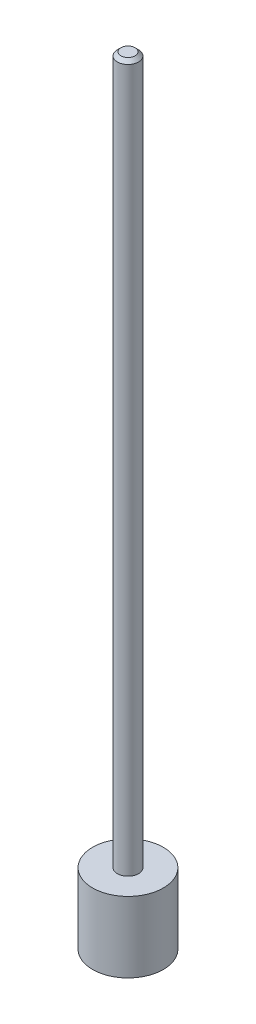
ISO-10303-21;
HEADER;
FILE_DESCRIPTION(('STEP AP214'),'2;1');
FILE_NAME('part.step','',(''),(''),'','','');
FILE_SCHEMA(('AUTOMOTIVE_DESIGN { 1 0 10303 214 1 1 1 1 }'));
ENDSEC;
DATA;
#1=APPLICATION_CONTEXT('core data for automotive mechanical design processes');
#2=APPLICATION_PROTOCOL_DEFINITION('international standard','automotive_design',2000,#1);
#3=PRODUCT_CONTEXT('',#1,'mechanical');
#4=PRODUCT('Part','Part','',(#3));
#5=PRODUCT_RELATED_PRODUCT_CATEGORY('part','',(#4));
#6=PRODUCT_DEFINITION_FORMATION('','',#4);
#7=PRODUCT_DEFINITION_CONTEXT('part definition',#1,'design');
#8=PRODUCT_DEFINITION('design','',#6,#7);
#9=PRODUCT_DEFINITION_SHAPE('','',#8);
#10=(LENGTH_UNIT() NAMED_UNIT(*) SI_UNIT(.MILLI.,.METRE.));
#11=(NAMED_UNIT(*) PLANE_ANGLE_UNIT() SI_UNIT($,.RADIAN.));
#12=(NAMED_UNIT(*) SI_UNIT($,.STERADIAN.) SOLID_ANGLE_UNIT());
#13=UNCERTAINTY_MEASURE_WITH_UNIT(LENGTH_MEASURE(1.E-05),#10,'distance_accuracy_value','');
#14=(GEOMETRIC_REPRESENTATION_CONTEXT(3) GLOBAL_UNCERTAINTY_ASSIGNED_CONTEXT((#13)) GLOBAL_UNIT_ASSIGNED_CONTEXT((#10,
#11,#12)) REPRESENTATION_CONTEXT('',''));
#15=CARTESIAN_POINT('',(0.,0.,0.));
#16=DIRECTION('',(0.,0.,1.));
#17=DIRECTION('',(1.,0.,0.));
#18=AXIS2_PLACEMENT_3D('',#15,#16,#17);
#19=CARTESIAN_POINT('',(0.,10.,0.));
#20=DIRECTION('',(0.,-1.,0.));
#21=DIRECTION('',(0.,0.,-1.));
#22=AXIS2_PLACEMENT_3D('',#19,#20,#21);
#23=CYLINDRICAL_SURFACE('',#22,5.);
#24=CARTESIAN_POINT('',(0.,10.,0.));
#25=DIRECTION('',(0.,1.,0.));
#26=DIRECTION('',(0.,0.,1.));
#27=AXIS2_PLACEMENT_3D('',#24,#25,#26);
#28=CIRCLE('',#27,5.);
#29=CARTESIAN_POINT('',(0.,10.,5.));
#30=VERTEX_POINT('',#29);
#31=EDGE_CURVE('E58',#30,#30,#28,.T.);
#32=ORIENTED_EDGE('',*,*,#31,.F.);
#33=EDGE_LOOP('',(#32));
#34=FACE_BOUND('',#33,.T.);
#35=CARTESIAN_POINT('',(0.,0.,0.));
#36=DIRECTION('',(0.,1.,0.));
#37=DIRECTION('',(0.,0.,1.));
#38=AXIS2_PLACEMENT_3D('',#35,#36,#37);
#39=CIRCLE('',#38,5.);
#40=CARTESIAN_POINT('',(0.,0.,5.));
#41=VERTEX_POINT('',#40);
#42=EDGE_CURVE('E61',#41,#41,#39,.T.);
#43=ORIENTED_EDGE('',*,*,#42,.T.);
#44=EDGE_LOOP('',(#43));
#45=FACE_BOUND('',#44,.T.);
#46=ADVANCED_FACE('F39',(#34,#45),#23,.T.);
#47=CARTESIAN_POINT('',(0.,10.,0.));
#48=DIRECTION('',(0.,1.,0.));
#49=DIRECTION('',(0.,0.,1.));
#50=AXIS2_PLACEMENT_3D('',#47,#48,#49);
#51=PLANE('',#50);
#52=CARTESIAN_POINT('',(0.,10.,0.));
#53=DIRECTION('',(0.,1.,0.));
#54=DIRECTION('',(0.,0.,1.));
#55=AXIS2_PLACEMENT_3D('',#52,#53,#54);
#56=CIRCLE('',#55,1.5);
#57=CARTESIAN_POINT('',(0.,10.,1.5));
#58=VERTEX_POINT('',#57);
#59=EDGE_CURVE('E53',#58,#58,#56,.T.);
#60=ORIENTED_EDGE('',*,*,#59,.F.);
#61=EDGE_LOOP('',(#60));
#62=FACE_BOUND('',#61,.T.);
#63=ORIENTED_EDGE('',*,*,#31,.T.);
#64=EDGE_LOOP('',(#63));
#65=FACE_BOUND('',#64,.T.);
#66=ADVANCED_FACE('F69',(#62,#65),#51,.T.);
#67=CARTESIAN_POINT('',(0.,0.,0.));
#68=DIRECTION('',(0.,1.,0.));
#69=DIRECTION('',(0.,0.,1.));
#70=AXIS2_PLACEMENT_3D('',#67,#68,#69);
#71=PLANE('',#70);
#72=ORIENTED_EDGE('',*,*,#42,.F.);
#73=EDGE_LOOP('',(#72));
#74=FACE_BOUND('',#73,.T.);
#75=ADVANCED_FACE('F75',(#74),#71,.F.);
#76=CARTESIAN_POINT('',(0.,110.,0.));
#77=DIRECTION('',(0.,-1.,0.));
#78=DIRECTION('',(0.,0.,-1.));
#79=AXIS2_PLACEMENT_3D('',#76,#77,#78);
#80=CYLINDRICAL_SURFACE('',#79,1.5);
#81=CARTESIAN_POINT('',(0.,109.5,0.));
#82=DIRECTION('',(0.,1.,0.));
#83=DIRECTION('',(0.,0.,1.));
#84=AXIS2_PLACEMENT_3D('',#81,#82,#83);
#85=CIRCLE('',#84,1.5);
#86=CARTESIAN_POINT('',(0.,109.5,1.5));
#87=VERTEX_POINT('',#86);
#88=EDGE_CURVE('E10',#87,#87,#85,.F.);
#89=ORIENTED_EDGE('',*,*,#88,.T.);
#90=EDGE_LOOP('',(#89));
#91=FACE_BOUND('',#90,.T.);
#92=ORIENTED_EDGE('',*,*,#59,.T.);
#93=EDGE_LOOP('',(#92));
#94=FACE_BOUND('',#93,.T.);
#95=ADVANCED_FACE('F77',(#91,#94),#80,.T.);
#96=CARTESIAN_POINT('',(0.,110.,0.));
#97=DIRECTION('',(0.,1.,0.));
#98=DIRECTION('',(0.,0.,1.));
#99=AXIS2_PLACEMENT_3D('',#96,#97,#98);
#100=PLANE('',#99);
#101=CARTESIAN_POINT('',(0.,110.,0.));
#102=DIRECTION('',(0.,1.,0.));
#103=DIRECTION('',(0.,0.,1.));
#104=AXIS2_PLACEMENT_3D('',#101,#102,#103);
#105=CIRCLE('',#104,1.);
#106=CARTESIAN_POINT('',(0.,110.,1.));
#107=VERTEX_POINT('',#106);
#108=EDGE_CURVE('E48',#107,#107,#105,.T.);
#109=ORIENTED_EDGE('',*,*,#108,.T.);
#110=EDGE_LOOP('',(#109));
#111=FACE_BOUND('',#110,.T.);
#112=ADVANCED_FACE('F83',(#111),#100,.T.);
#113=CARTESIAN_POINT('',(0.,110.,0.));
#114=DIRECTION('',(0.,-1.,0.));
#115=DIRECTION('',(0.,0.,-1.));
#116=AXIS2_PLACEMENT_3D('',#113,#114,#115);
#117=CONICAL_SURFACE('',#116,1.,0.785398163397447);
#118=ORIENTED_EDGE('',*,*,#88,.F.);
#119=EDGE_LOOP('',(#118));
#120=FACE_BOUND('',#119,.T.);
#121=ORIENTED_EDGE('',*,*,#108,.F.);
#122=EDGE_LOOP('',(#121));
#123=FACE_BOUND('',#122,.T.);
#124=ADVANCED_FACE('F42',(#120,#123),#117,.T.);
#125=CLOSED_SHELL('',(#46,#66,#75,#95,#112,#124));
#126=MANIFOLD_SOLID_BREP('B2',#125);
#127=ADVANCED_BREP_SHAPE_REPRESENTATION('',(#18,#126),#14);
#128=SHAPE_DEFINITION_REPRESENTATION(#9,#127);
ENDSEC;
END-ISO-10303-21;
